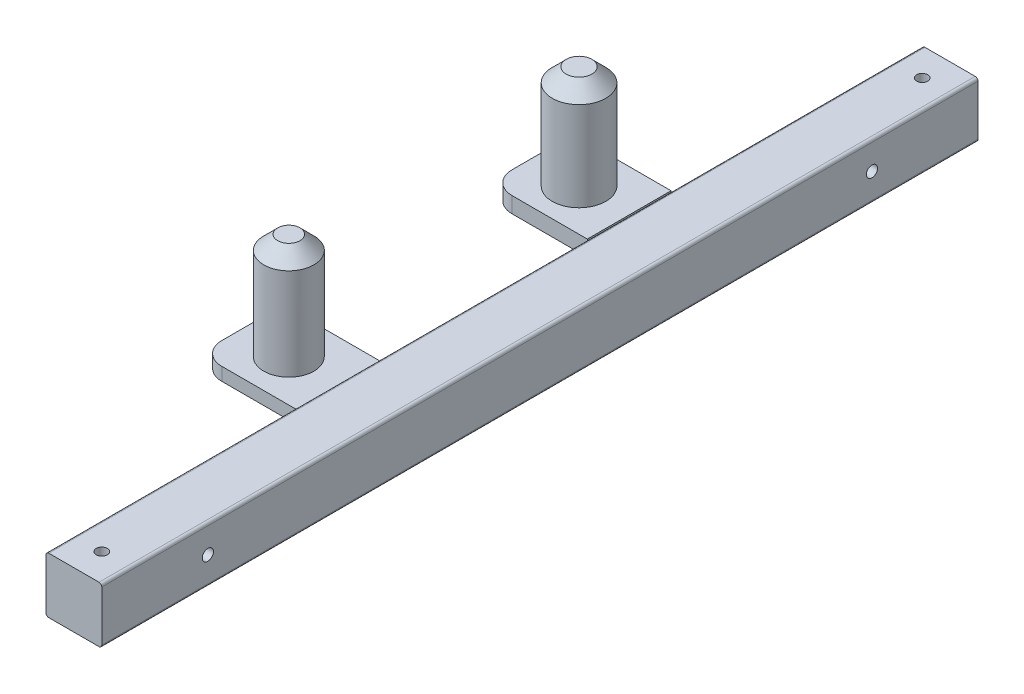
ISO-10303-21;
HEADER;
FILE_DESCRIPTION(('STEP AP214'),'2;1');
FILE_NAME('part.step','',(''),(''),'','','');
FILE_SCHEMA(('AUTOMOTIVE_DESIGN { 1 0 10303 214 1 1 1 1 }'));
ENDSEC;
DATA;
#1=APPLICATION_CONTEXT('core data for automotive mechanical design processes');
#2=APPLICATION_PROTOCOL_DEFINITION('international standard','automotive_design',2000,#1);
#3=PRODUCT_CONTEXT('',#1,'mechanical');
#4=PRODUCT('Part','Part','',(#3));
#5=PRODUCT_RELATED_PRODUCT_CATEGORY('part','',(#4));
#6=PRODUCT_DEFINITION_FORMATION('','',#4);
#7=PRODUCT_DEFINITION_CONTEXT('part definition',#1,'design');
#8=PRODUCT_DEFINITION('design','',#6,#7);
#9=PRODUCT_DEFINITION_SHAPE('','',#8);
#10=(LENGTH_UNIT() NAMED_UNIT(*) SI_UNIT(.MILLI.,.METRE.));
#11=(NAMED_UNIT(*) PLANE_ANGLE_UNIT() SI_UNIT($,.RADIAN.));
#12=(NAMED_UNIT(*) SI_UNIT($,.STERADIAN.) SOLID_ANGLE_UNIT());
#13=UNCERTAINTY_MEASURE_WITH_UNIT(LENGTH_MEASURE(1.E-05),#10,'distance_accuracy_value','');
#14=(GEOMETRIC_REPRESENTATION_CONTEXT(3) GLOBAL_UNCERTAINTY_ASSIGNED_CONTEXT((#13)) GLOBAL_UNIT_ASSIGNED_CONTEXT((#10,
#11,#12)) REPRESENTATION_CONTEXT('',''));
#15=CARTESIAN_POINT('',(0.,0.,0.));
#16=DIRECTION('',(0.,0.,1.));
#17=DIRECTION('',(1.,0.,0.));
#18=AXIS2_PLACEMENT_3D('',#15,#16,#17);
#19=CARTESIAN_POINT('',(0.,0.,314.));
#20=DIRECTION('',(1.,0.,0.));
#21=DIRECTION('',(0.,0.,-1.));
#22=AXIS2_PLACEMENT_3D('',#19,#20,#21);
#23=PLANE('',#22);
#24=CARTESIAN_POINT('',(0.,10.,276.));
#25=DIRECTION('',(-1.,0.,0.));
#26=DIRECTION('',(0.,0.,1.));
#27=AXIS2_PLACEMENT_3D('',#24,#25,#26);
#28=CIRCLE('',#27,2.);
#29=CARTESIAN_POINT('',(0.,10.,278.));
#30=VERTEX_POINT('',#29);
#31=EDGE_CURVE('E265',#30,#30,#28,.T.);
#32=ORIENTED_EDGE('',*,*,#31,.F.);
#33=EDGE_LOOP('',(#32));
#34=FACE_BOUND('',#33,.T.);
#35=CARTESIAN_POINT('',(0.,10.,38.));
#36=DIRECTION('',(-1.,0.,0.));
#37=DIRECTION('',(0.,0.,1.));
#38=AXIS2_PLACEMENT_3D('',#35,#36,#37);
#39=CIRCLE('',#38,2.);
#40=CARTESIAN_POINT('',(0.,10.,40.));
#41=VERTEX_POINT('',#40);
#42=EDGE_CURVE('E260',#41,#41,#39,.T.);
#43=ORIENTED_EDGE('',*,*,#42,.F.);
#44=EDGE_LOOP('',(#43));
#45=FACE_BOUND('',#44,.T.);
#46=DIRECTION('',(0.,1.,0.));
#47=VECTOR('',#46,1.);
#48=CARTESIAN_POINT('',(0.,19.,224.));
#49=LINE('',#48,#47);
#50=CARTESIAN_POINT('',(0.,14.3386472819823,224.));
#51=VERTEX_POINT('',#50);
#52=CARTESIAN_POINT('',(0.,19.,224.));
#53=VERTEX_POINT('',#52);
#54=EDGE_CURVE('E219',#51,#53,#49,.T.);
#55=ORIENTED_EDGE('',*,*,#54,.F.);
#56=DIRECTION('',(0.,0.,1.));
#57=VECTOR('',#56,1.);
#58=CARTESIAN_POINT('',(0.,14.3386472819823,224.));
#59=LINE('',#58,#57);
#60=CARTESIAN_POINT('',(0.,14.3386472819823,194.));
#61=VERTEX_POINT('',#60);
#62=EDGE_CURVE('E216',#61,#51,#59,.T.);
#63=ORIENTED_EDGE('',*,*,#62,.F.);
#64=DIRECTION('',(0.,-1.,0.));
#65=VECTOR('',#64,1.);
#66=CARTESIAN_POINT('',(0.,19.,194.));
#67=LINE('',#66,#65);
#68=CARTESIAN_POINT('',(0.,19.,194.));
#69=VERTEX_POINT('',#68);
#70=EDGE_CURVE('E190',#69,#61,#67,.T.);
#71=ORIENTED_EDGE('',*,*,#70,.F.);
#72=DIRECTION('',(0.,0.,-1.));
#73=VECTOR('',#72,1.);
#74=CARTESIAN_POINT('',(0.,19.,314.));
#75=LINE('',#74,#73);
#76=CARTESIAN_POINT('',(0.,19.,120.));
#77=VERTEX_POINT('',#76);
#78=EDGE_CURVE('E199',#69,#77,#75,.T.);
#79=ORIENTED_EDGE('',*,*,#78,.T.);
#80=DIRECTION('',(0.,1.,0.));
#81=VECTOR('',#80,1.);
#82=CARTESIAN_POINT('',(0.,20.,120.));
#83=LINE('',#82,#81);
#84=CARTESIAN_POINT('',(0.,14.3386472819823,120.));
#85=VERTEX_POINT('',#84);
#86=EDGE_CURVE('E248',#85,#77,#83,.T.);
#87=ORIENTED_EDGE('',*,*,#86,.F.);
#88=DIRECTION('',(0.,0.,1.));
#89=VECTOR('',#88,1.);
#90=CARTESIAN_POINT('',(0.,14.3386472819823,90.));
#91=LINE('',#90,#89);
#92=CARTESIAN_POINT('',(0.,14.3386472819823,90.));
#93=VERTEX_POINT('',#92);
#94=EDGE_CURVE('E244',#93,#85,#91,.T.);
#95=ORIENTED_EDGE('',*,*,#94,.F.);
#96=DIRECTION('',(0.,-1.,0.));
#97=VECTOR('',#96,1.);
#98=CARTESIAN_POINT('',(0.,20.,90.));
#99=LINE('',#98,#97);
#100=CARTESIAN_POINT('',(0.,19.,90.));
#101=VERTEX_POINT('',#100);
#102=EDGE_CURVE('E232',#101,#93,#99,.T.);
#103=ORIENTED_EDGE('',*,*,#102,.F.);
#104=CARTESIAN_POINT('',(0.,19.,0.));
#105=VERTEX_POINT('',#104);
#106=EDGE_CURVE('E212',#101,#105,#75,.T.);
#107=ORIENTED_EDGE('',*,*,#106,.T.);
#108=DIRECTION('',(0.,-1.,0.));
#109=VECTOR('',#108,1.);
#110=CARTESIAN_POINT('',(0.,0.,0.));
#111=LINE('',#110,#109);
#112=CARTESIAN_POINT('',(0.,1.,0.));
#113=VERTEX_POINT('',#112);
#114=EDGE_CURVE('E284',#105,#113,#111,.T.);
#115=ORIENTED_EDGE('',*,*,#114,.T.);
#116=DIRECTION('',(0.,0.,-1.));
#117=VECTOR('',#116,1.);
#118=CARTESIAN_POINT('',(0.,1.,314.));
#119=LINE('',#118,#117);
#120=CARTESIAN_POINT('',(0.,1.,314.));
#121=VERTEX_POINT('',#120);
#122=EDGE_CURVE('E321',#113,#121,#119,.F.);
#123=ORIENTED_EDGE('',*,*,#122,.T.);
#124=DIRECTION('',(0.,-1.,0.));
#125=VECTOR('',#124,1.);
#126=CARTESIAN_POINT('',(0.,0.,314.));
#127=LINE('',#126,#125);
#128=CARTESIAN_POINT('',(0.,19.,314.));
#129=VERTEX_POINT('',#128);
#130=EDGE_CURVE('E285',#129,#121,#127,.T.);
#131=ORIENTED_EDGE('',*,*,#130,.F.);
#132=EDGE_CURVE('E210',#129,#53,#75,.T.);
#133=ORIENTED_EDGE('',*,*,#132,.T.);
#134=EDGE_LOOP('',(#55,#63,#71,#79,#87,#95,#103,#107,#115,#123,#131,#133));
#135=FACE_BOUND('',#134,.T.);
#136=ADVANCED_FACE('F43',(#34,#45,#135),#23,.F.);
#137=CARTESIAN_POINT('',(0.,0.,314.));
#138=DIRECTION('',(0.,1.,0.));
#139=DIRECTION('',(0.,0.,1.));
#140=AXIS2_PLACEMENT_3D('',#137,#138,#139);
#141=PLANE('',#140);
#142=CARTESIAN_POINT('',(10.,0.,10.));
#143=DIRECTION('',(0.,1.,0.));
#144=DIRECTION('',(0.,0.,1.));
#145=AXIS2_PLACEMENT_3D('',#142,#143,#144);
#146=CIRCLE('',#145,2.);
#147=CARTESIAN_POINT('',(10.,0.,12.));
#148=VERTEX_POINT('',#147);
#149=EDGE_CURVE('E281',#148,#148,#146,.T.);
#150=ORIENTED_EDGE('',*,*,#149,.T.);
#151=EDGE_LOOP('',(#150));
#152=FACE_BOUND('',#151,.T.);
#153=CARTESIAN_POINT('',(10.,0.,304.));
#154=DIRECTION('',(0.,1.,0.));
#155=DIRECTION('',(0.,0.,1.));
#156=AXIS2_PLACEMENT_3D('',#153,#154,#155);
#157=CIRCLE('',#156,2.);
#158=CARTESIAN_POINT('',(10.,0.,306.));
#159=VERTEX_POINT('',#158);
#160=EDGE_CURVE('E276',#159,#159,#157,.T.);
#161=ORIENTED_EDGE('',*,*,#160,.T.);
#162=EDGE_LOOP('',(#161));
#163=FACE_BOUND('',#162,.T.);
#164=DIRECTION('',(1.,0.,0.));
#165=VECTOR('',#164,1.);
#166=CARTESIAN_POINT('',(0.,0.,314.));
#167=LINE('',#166,#165);
#168=CARTESIAN_POINT('',(1.,0.,314.));
#169=VERTEX_POINT('',#168);
#170=CARTESIAN_POINT('',(19.,0.,314.));
#171=VERTEX_POINT('',#170);
#172=EDGE_CURVE('E288',#169,#171,#167,.T.);
#173=ORIENTED_EDGE('',*,*,#172,.F.);
#174=DIRECTION('',(0.,0.,-1.));
#175=VECTOR('',#174,1.);
#176=CARTESIAN_POINT('',(1.,0.,314.));
#177=LINE('',#176,#175);
#178=CARTESIAN_POINT('',(1.,0.,0.));
#179=VERTEX_POINT('',#178);
#180=EDGE_CURVE('E310',#169,#179,#177,.T.);
#181=ORIENTED_EDGE('',*,*,#180,.T.);
#182=DIRECTION('',(1.,0.,0.));
#183=VECTOR('',#182,1.);
#184=CARTESIAN_POINT('',(0.,0.,0.));
#185=LINE('',#184,#183);
#186=CARTESIAN_POINT('',(19.,0.,0.));
#187=VERTEX_POINT('',#186);
#188=EDGE_CURVE('E301',#179,#187,#185,.T.);
#189=ORIENTED_EDGE('',*,*,#188,.T.);
#190=DIRECTION('',(0.,0.,-1.));
#191=VECTOR('',#190,1.);
#192=CARTESIAN_POINT('',(19.,0.,314.));
#193=LINE('',#192,#191);
#194=EDGE_CURVE('E298',#187,#171,#193,.F.);
#195=ORIENTED_EDGE('',*,*,#194,.T.);
#196=EDGE_LOOP('',(#173,#181,#189,#195));
#197=FACE_BOUND('',#196,.T.);
#198=ADVANCED_FACE('F401',(#152,#163,#197),#141,.F.);
#199=CARTESIAN_POINT('',(20.,0.,314.));
#200=DIRECTION('',(-1.,0.,0.));
#201=DIRECTION('',(0.,0.,1.));
#202=AXIS2_PLACEMENT_3D('',#199,#200,#201);
#203=PLANE('',#202);
#204=CARTESIAN_POINT('',(20.,10.,276.));
#205=DIRECTION('',(-1.,0.,0.));
#206=DIRECTION('',(0.,0.,1.));
#207=AXIS2_PLACEMENT_3D('',#204,#205,#206);
#208=CIRCLE('',#207,2.);
#209=CARTESIAN_POINT('',(20.,10.,278.));
#210=VERTEX_POINT('',#209);
#211=EDGE_CURVE('E261',#210,#210,#208,.T.);
#212=ORIENTED_EDGE('',*,*,#211,.T.);
#213=EDGE_LOOP('',(#212));
#214=FACE_BOUND('',#213,.T.);
#215=CARTESIAN_POINT('',(20.,10.,38.));
#216=DIRECTION('',(-1.,0.,0.));
#217=DIRECTION('',(0.,0.,1.));
#218=AXIS2_PLACEMENT_3D('',#215,#216,#217);
#219=CIRCLE('',#218,2.);
#220=CARTESIAN_POINT('',(20.,10.,40.));
#221=VERTEX_POINT('',#220);
#222=EDGE_CURVE('E268',#221,#221,#219,.T.);
#223=ORIENTED_EDGE('',*,*,#222,.T.);
#224=EDGE_LOOP('',(#223));
#225=FACE_BOUND('',#224,.T.);
#226=DIRECTION('',(0.,1.,0.));
#227=VECTOR('',#226,1.);
#228=CARTESIAN_POINT('',(20.,0.,314.));
#229=LINE('',#228,#227);
#230=CARTESIAN_POINT('',(20.,1.,314.));
#231=VERTEX_POINT('',#230);
#232=CARTESIAN_POINT('',(20.,19.,314.));
#233=VERTEX_POINT('',#232);
#234=EDGE_CURVE('E292',#231,#233,#229,.T.);
#235=ORIENTED_EDGE('',*,*,#234,.F.);
#236=DIRECTION('',(0.,0.,-1.));
#237=VECTOR('',#236,1.);
#238=CARTESIAN_POINT('',(20.,1.,314.));
#239=LINE('',#238,#237);
#240=CARTESIAN_POINT('',(20.,1.,0.));
#241=VERTEX_POINT('',#240);
#242=EDGE_CURVE('E333',#231,#241,#239,.T.);
#243=ORIENTED_EDGE('',*,*,#242,.T.);
#244=DIRECTION('',(0.,1.,0.));
#245=VECTOR('',#244,1.);
#246=CARTESIAN_POINT('',(20.,0.,0.));
#247=LINE('',#246,#245);
#248=CARTESIAN_POINT('',(20.,19.,0.));
#249=VERTEX_POINT('',#248);
#250=EDGE_CURVE('E304',#241,#249,#247,.T.);
#251=ORIENTED_EDGE('',*,*,#250,.T.);
#252=DIRECTION('',(0.,0.,-1.));
#253=VECTOR('',#252,1.);
#254=CARTESIAN_POINT('',(20.,19.,314.));
#255=LINE('',#254,#253);
#256=EDGE_CURVE('E331',#249,#233,#255,.F.);
#257=ORIENTED_EDGE('',*,*,#256,.T.);
#258=EDGE_LOOP('',(#235,#243,#251,#257));
#259=FACE_BOUND('',#258,.T.);
#260=ADVANCED_FACE('F409',(#214,#225,#259),#203,.F.);
#261=CARTESIAN_POINT('',(0.,20.,314.));
#262=DIRECTION('',(0.,-1.,0.));
#263=DIRECTION('',(0.,0.,-1.));
#264=AXIS2_PLACEMENT_3D('',#261,#262,#263);
#265=PLANE('',#264);
#266=CARTESIAN_POINT('',(10.,20.,10.));
#267=DIRECTION('',(0.,1.,0.));
#268=DIRECTION('',(0.,0.,1.));
#269=AXIS2_PLACEMENT_3D('',#266,#267,#268);
#270=CIRCLE('',#269,2.);
#271=CARTESIAN_POINT('',(10.,20.,12.));
#272=VERTEX_POINT('',#271);
#273=EDGE_CURVE('E273',#272,#272,#270,.T.);
#274=ORIENTED_EDGE('',*,*,#273,.F.);
#275=EDGE_LOOP('',(#274));
#276=FACE_BOUND('',#275,.T.);
#277=CARTESIAN_POINT('',(10.,20.,304.));
#278=DIRECTION('',(0.,1.,0.));
#279=DIRECTION('',(0.,0.,1.));
#280=AXIS2_PLACEMENT_3D('',#277,#278,#279);
#281=CIRCLE('',#280,2.);
#282=CARTESIAN_POINT('',(10.,20.,306.));
#283=VERTEX_POINT('',#282);
#284=EDGE_CURVE('E264',#283,#283,#281,.T.);
#285=ORIENTED_EDGE('',*,*,#284,.F.);
#286=EDGE_LOOP('',(#285));
#287=FACE_BOUND('',#286,.T.);
#288=DIRECTION('',(-1.,0.,0.));
#289=VECTOR('',#288,1.);
#290=CARTESIAN_POINT('',(0.,20.,0.));
#291=LINE('',#290,#289);
#292=CARTESIAN_POINT('',(19.,20.,0.));
#293=VERTEX_POINT('',#292);
#294=CARTESIAN_POINT('',(1.,20.,0.));
#295=VERTEX_POINT('',#294);
#296=EDGE_CURVE('E289',#293,#295,#291,.T.);
#297=ORIENTED_EDGE('',*,*,#296,.T.);
#298=DIRECTION('',(0.,0.,-1.));
#299=VECTOR('',#298,1.);
#300=CARTESIAN_POINT('',(1.,20.,314.));
#301=LINE('',#300,#299);
#302=CARTESIAN_POINT('',(1.,20.,314.));
#303=VERTEX_POINT('',#302);
#304=EDGE_CURVE('E339',#295,#303,#301,.F.);
#305=ORIENTED_EDGE('',*,*,#304,.T.);
#306=DIRECTION('',(-1.,0.,0.));
#307=VECTOR('',#306,1.);
#308=CARTESIAN_POINT('',(0.,20.,314.));
#309=LINE('',#308,#307);
#310=CARTESIAN_POINT('',(19.,20.,314.));
#311=VERTEX_POINT('',#310);
#312=EDGE_CURVE('E295',#311,#303,#309,.T.);
#313=ORIENTED_EDGE('',*,*,#312,.F.);
#314=DIRECTION('',(0.,0.,-1.));
#315=VECTOR('',#314,1.);
#316=CARTESIAN_POINT('',(19.,20.,314.));
#317=LINE('',#316,#315);
#318=EDGE_CURVE('E336',#311,#293,#317,.T.);
#319=ORIENTED_EDGE('',*,*,#318,.T.);
#320=EDGE_LOOP('',(#297,#305,#313,#319));
#321=FACE_BOUND('',#320,.T.);
#322=ADVANCED_FACE('F529',(#276,#287,#321),#265,.F.);
#323=CARTESIAN_POINT('',(0.,0.,314.));
#324=DIRECTION('',(0.,0.,-1.));
#325=DIRECTION('',(-1.,0.,0.));
#326=AXIS2_PLACEMENT_3D('',#323,#324,#325);
#327=PLANE('',#326);
#328=ORIENTED_EDGE('',*,*,#130,.T.);
#329=CARTESIAN_POINT('',(1.,1.,314.));
#330=DIRECTION('',(0.,0.,-1.));
#331=DIRECTION('',(-1.,0.,0.));
#332=AXIS2_PLACEMENT_3D('',#329,#330,#331);
#333=CIRCLE('',#332,1.);
#334=EDGE_CURVE('E329',#121,#169,#333,.F.);
#335=ORIENTED_EDGE('',*,*,#334,.T.);
#336=ORIENTED_EDGE('',*,*,#172,.T.);
#337=CARTESIAN_POINT('',(19.,1.,314.));
#338=DIRECTION('',(0.,0.,-1.));
#339=DIRECTION('',(-1.,0.,0.));
#340=AXIS2_PLACEMENT_3D('',#337,#338,#339);
#341=CIRCLE('',#340,1.);
#342=EDGE_CURVE('E327',#171,#231,#341,.F.);
#343=ORIENTED_EDGE('',*,*,#342,.T.);
#344=ORIENTED_EDGE('',*,*,#234,.T.);
#345=CARTESIAN_POINT('',(19.,19.,314.));
#346=DIRECTION('',(0.,0.,-1.));
#347=DIRECTION('',(-1.,0.,0.));
#348=AXIS2_PLACEMENT_3D('',#345,#346,#347);
#349=CIRCLE('',#348,1.);
#350=EDGE_CURVE('E323',#233,#311,#349,.F.);
#351=ORIENTED_EDGE('',*,*,#350,.T.);
#352=ORIENTED_EDGE('',*,*,#312,.T.);
#353=CARTESIAN_POINT('',(1.,19.,314.));
#354=DIRECTION('',(0.,0.,-1.));
#355=DIRECTION('',(-1.,0.,0.));
#356=AXIS2_PLACEMENT_3D('',#353,#354,#355);
#357=CIRCLE('',#356,1.);
#358=EDGE_CURVE('E325',#303,#129,#357,.F.);
#359=ORIENTED_EDGE('',*,*,#358,.T.);
#360=EDGE_LOOP('',(#328,#335,#336,#343,#344,#351,#352,#359));
#361=FACE_BOUND('',#360,.T.);
#362=ADVANCED_FACE('F526',(#361),#327,.F.);
#363=CARTESIAN_POINT('',(0.,0.,0.));
#364=DIRECTION('',(0.,0.,-1.));
#365=DIRECTION('',(-1.,0.,0.));
#366=AXIS2_PLACEMENT_3D('',#363,#364,#365);
#367=PLANE('',#366);
#368=ORIENTED_EDGE('',*,*,#188,.F.);
#369=CARTESIAN_POINT('',(1.,1.,0.));
#370=DIRECTION('',(0.,0.,-1.));
#371=DIRECTION('',(-1.,0.,0.));
#372=AXIS2_PLACEMENT_3D('',#369,#370,#371);
#373=CIRCLE('',#372,1.);
#374=EDGE_CURVE('E319',#179,#113,#373,.T.);
#375=ORIENTED_EDGE('',*,*,#374,.T.);
#376=ORIENTED_EDGE('',*,*,#114,.F.);
#377=CARTESIAN_POINT('',(1.,19.,0.));
#378=DIRECTION('',(0.,0.,-1.));
#379=DIRECTION('',(-1.,0.,0.));
#380=AXIS2_PLACEMENT_3D('',#377,#378,#379);
#381=CIRCLE('',#380,1.);
#382=EDGE_CURVE('E315',#105,#295,#381,.T.);
#383=ORIENTED_EDGE('',*,*,#382,.T.);
#384=ORIENTED_EDGE('',*,*,#296,.F.);
#385=CARTESIAN_POINT('',(19.,19.,0.));
#386=DIRECTION('',(0.,0.,-1.));
#387=DIRECTION('',(-1.,0.,0.));
#388=AXIS2_PLACEMENT_3D('',#385,#386,#387);
#389=CIRCLE('',#388,1.);
#390=EDGE_CURVE('E313',#293,#249,#389,.T.);
#391=ORIENTED_EDGE('',*,*,#390,.T.);
#392=ORIENTED_EDGE('',*,*,#250,.F.);
#393=CARTESIAN_POINT('',(19.,1.,0.));
#394=DIRECTION('',(0.,0.,-1.));
#395=DIRECTION('',(-1.,0.,0.));
#396=AXIS2_PLACEMENT_3D('',#393,#394,#395);
#397=CIRCLE('',#396,1.);
#398=EDGE_CURVE('E317',#241,#187,#397,.T.);
#399=ORIENTED_EDGE('',*,*,#398,.T.);
#400=EDGE_LOOP('',(#368,#375,#376,#383,#384,#391,#392,#399));
#401=FACE_BOUND('',#400,.T.);
#402=ADVANCED_FACE('F524',(#401),#367,.T.);
#403=CARTESIAN_POINT('',(10.,-294.,304.));
#404=DIRECTION('',(0.,1.,0.));
#405=DIRECTION('',(0.,0.,1.));
#406=AXIS2_PLACEMENT_3D('',#403,#404,#405);
#407=CYLINDRICAL_SURFACE('',#406,2.);
#408=ORIENTED_EDGE('',*,*,#284,.T.);
#409=EDGE_LOOP('',(#408));
#410=FACE_BOUND('',#409,.T.);
#411=ORIENTED_EDGE('',*,*,#160,.F.);
#412=EDGE_LOOP('',(#411));
#413=FACE_BOUND('',#412,.T.);
#414=ADVANCED_FACE('F520',(#410,#413),#407,.F.);
#415=CARTESIAN_POINT('',(10.,-294.,10.));
#416=DIRECTION('',(0.,1.,0.));
#417=DIRECTION('',(0.,0.,1.));
#418=AXIS2_PLACEMENT_3D('',#415,#416,#417);
#419=CYLINDRICAL_SURFACE('',#418,2.);
#420=ORIENTED_EDGE('',*,*,#273,.T.);
#421=EDGE_LOOP('',(#420));
#422=FACE_BOUND('',#421,.T.);
#423=ORIENTED_EDGE('',*,*,#149,.F.);
#424=EDGE_LOOP('',(#423));
#425=FACE_BOUND('',#424,.T.);
#426=ADVANCED_FACE('F420',(#422,#425),#419,.F.);
#427=CARTESIAN_POINT('',(1.,1.,314.));
#428=DIRECTION('',(0.,0.,-1.));
#429=DIRECTION('',(-1.,0.,0.));
#430=AXIS2_PLACEMENT_3D('',#427,#428,#429);
#431=CYLINDRICAL_SURFACE('',#430,1.);
#432=ORIENTED_EDGE('',*,*,#334,.F.);
#433=ORIENTED_EDGE('',*,*,#122,.F.);
#434=ORIENTED_EDGE('',*,*,#374,.F.);
#435=ORIENTED_EDGE('',*,*,#180,.F.);
#436=EDGE_LOOP('',(#432,#433,#434,#435));
#437=FACE_BOUND('',#436,.T.);
#438=ADVANCED_FACE('F416',(#437),#431,.T.);
#439=CARTESIAN_POINT('',(19.,1.,314.));
#440=DIRECTION('',(0.,0.,-1.));
#441=DIRECTION('',(-1.,0.,0.));
#442=AXIS2_PLACEMENT_3D('',#439,#440,#441);
#443=CYLINDRICAL_SURFACE('',#442,1.);
#444=ORIENTED_EDGE('',*,*,#342,.F.);
#445=ORIENTED_EDGE('',*,*,#194,.F.);
#446=ORIENTED_EDGE('',*,*,#398,.F.);
#447=ORIENTED_EDGE('',*,*,#242,.F.);
#448=EDGE_LOOP('',(#444,#445,#446,#447));
#449=FACE_BOUND('',#448,.T.);
#450=ADVANCED_FACE('F419',(#449),#443,.T.);
#451=CARTESIAN_POINT('',(1.,19.,314.));
#452=DIRECTION('',(0.,0.,-1.));
#453=DIRECTION('',(-1.,0.,0.));
#454=AXIS2_PLACEMENT_3D('',#451,#452,#453);
#455=CYLINDRICAL_SURFACE('',#454,1.);
#456=ORIENTED_EDGE('',*,*,#358,.F.);
#457=ORIENTED_EDGE('',*,*,#304,.F.);
#458=ORIENTED_EDGE('',*,*,#382,.F.);
#459=ORIENTED_EDGE('',*,*,#106,.F.);
#460=EDGE_CURVE('E206',#77,#101,#75,.T.);
#461=ORIENTED_EDGE('',*,*,#460,.F.);
#462=ORIENTED_EDGE('',*,*,#78,.F.);
#463=DIRECTION('',(0.,0.,-1.));
#464=VECTOR('',#463,1.);
#465=CARTESIAN_POINT('',(0.,19.,224.));
#466=LINE('',#465,#464);
#467=EDGE_CURVE('E203',#53,#69,#466,.T.);
#468=ORIENTED_EDGE('',*,*,#467,.F.);
#469=ORIENTED_EDGE('',*,*,#132,.F.);
#470=EDGE_LOOP('',(#456,#457,#458,#459,#461,#462,#468,#469));
#471=FACE_BOUND('',#470,.T.);
#472=ADVANCED_FACE('F201',(#471),#455,.T.);
#473=CARTESIAN_POINT('',(19.,19.,314.));
#474=DIRECTION('',(0.,0.,-1.));
#475=DIRECTION('',(-1.,0.,0.));
#476=AXIS2_PLACEMENT_3D('',#473,#474,#475);
#477=CYLINDRICAL_SURFACE('',#476,1.);
#478=ORIENTED_EDGE('',*,*,#350,.F.);
#479=ORIENTED_EDGE('',*,*,#256,.F.);
#480=ORIENTED_EDGE('',*,*,#390,.F.);
#481=ORIENTED_EDGE('',*,*,#318,.F.);
#482=EDGE_LOOP('',(#478,#479,#480,#481));
#483=FACE_BOUND('',#482,.T.);
#484=ADVANCED_FACE('F426',(#483),#477,.T.);
#485=CARTESIAN_POINT('',(20.,10.,38.));
#486=DIRECTION('',(-1.,0.,0.));
#487=DIRECTION('',(0.,0.,1.));
#488=AXIS2_PLACEMENT_3D('',#485,#486,#487);
#489=CYLINDRICAL_SURFACE('',#488,2.);
#490=ORIENTED_EDGE('',*,*,#222,.F.);
#491=EDGE_LOOP('',(#490));
#492=FACE_BOUND('',#491,.T.);
#493=ORIENTED_EDGE('',*,*,#42,.T.);
#494=EDGE_LOOP('',(#493));
#495=FACE_BOUND('',#494,.T.);
#496=ADVANCED_FACE('F429',(#492,#495),#489,.F.);
#497=CARTESIAN_POINT('',(20.,10.,276.));
#498=DIRECTION('',(-1.,0.,0.));
#499=DIRECTION('',(0.,0.,1.));
#500=AXIS2_PLACEMENT_3D('',#497,#498,#499);
#501=CYLINDRICAL_SURFACE('',#500,2.);
#502=ORIENTED_EDGE('',*,*,#211,.F.);
#503=EDGE_LOOP('',(#502));
#504=FACE_BOUND('',#503,.T.);
#505=ORIENTED_EDGE('',*,*,#31,.T.);
#506=EDGE_LOOP('',(#505));
#507=FACE_BOUND('',#506,.T.);
#508=ADVANCED_FACE('F510',(#504,#507),#501,.F.);
#509=CARTESIAN_POINT('',(-35.,20.,90.));
#510=DIRECTION('',(0.,0.,1.));
#511=DIRECTION('',(1.,0.,0.));
#512=AXIS2_PLACEMENT_3D('',#509,#510,#511);
#513=PLANE('',#512);
#514=DIRECTION('',(1.,0.,0.));
#515=VECTOR('',#514,1.);
#516=CARTESIAN_POINT('',(-35.,14.3386472819823,90.));
#517=LINE('',#516,#515);
#518=CARTESIAN_POINT('',(-27.,14.3386472819823,90.));
#519=VERTEX_POINT('',#518);
#520=EDGE_CURVE('E258',#519,#93,#517,.T.);
#521=ORIENTED_EDGE('',*,*,#520,.F.);
#522=DIRECTION('',(0.,-1.,0.));
#523=VECTOR('',#522,1.);
#524=CARTESIAN_POINT('',(-27.,20.,90.));
#525=LINE('',#524,#523);
#526=CARTESIAN_POINT('',(-27.,20.,90.));
#527=VERTEX_POINT('',#526);
#528=EDGE_CURVE('E357',#519,#527,#525,.F.);
#529=ORIENTED_EDGE('',*,*,#528,.T.);
#530=DIRECTION('',(1.,0.,0.));
#531=VECTOR('',#530,1.);
#532=CARTESIAN_POINT('',(-35.,20.,90.));
#533=LINE('',#532,#531);
#534=CARTESIAN_POINT('',(0.,20.,90.));
#535=VERTEX_POINT('',#534);
#536=EDGE_CURVE('E240',#527,#535,#533,.T.);
#537=ORIENTED_EDGE('',*,*,#536,.T.);
#538=EDGE_CURVE('E241',#535,#101,#99,.T.);
#539=ORIENTED_EDGE('',*,*,#538,.T.);
#540=ORIENTED_EDGE('',*,*,#102,.T.);
#541=EDGE_LOOP('',(#521,#529,#537,#539,#540));
#542=FACE_BOUND('',#541,.T.);
#543=ADVANCED_FACE('F506',(#542),#513,.F.);
#544=CARTESIAN_POINT('',(-35.,14.3386472819823,90.));
#545=DIRECTION('',(0.,1.,0.));
#546=DIRECTION('',(0.,0.,1.));
#547=AXIS2_PLACEMENT_3D('',#544,#545,#546);
#548=PLANE('',#547);
#549=DIRECTION('',(0.,0.,1.));
#550=VECTOR('',#549,1.);
#551=CARTESIAN_POINT('',(-35.,14.3386472819823,90.));
#552=LINE('',#551,#550);
#553=CARTESIAN_POINT('',(-35.,14.3386472819823,98.));
#554=VERTEX_POINT('',#553);
#555=CARTESIAN_POINT('',(-35.,14.3386472819823,112.));
#556=VERTEX_POINT('',#555);
#557=EDGE_CURVE('E233',#554,#556,#552,.T.);
#558=ORIENTED_EDGE('',*,*,#557,.F.);
#559=CARTESIAN_POINT('',(-27.,14.3386472819823,98.));
#560=DIRECTION('',(0.,1.,0.));
#561=DIRECTION('',(0.,0.,1.));
#562=AXIS2_PLACEMENT_3D('',#559,#560,#561);
#563=CIRCLE('',#562,8.);
#564=EDGE_CURVE('E355',#554,#519,#563,.F.);
#565=ORIENTED_EDGE('',*,*,#564,.T.);
#566=ORIENTED_EDGE('',*,*,#520,.T.);
#567=ORIENTED_EDGE('',*,*,#94,.T.);
#568=DIRECTION('',(1.,0.,0.));
#569=VECTOR('',#568,1.);
#570=CARTESIAN_POINT('',(-35.,14.3386472819823,120.));
#571=LINE('',#570,#569);
#572=CARTESIAN_POINT('',(-27.,14.3386472819823,120.));
#573=VERTEX_POINT('',#572);
#574=EDGE_CURVE('E256',#573,#85,#571,.T.);
#575=ORIENTED_EDGE('',*,*,#574,.F.);
#576=CARTESIAN_POINT('',(-27.,14.3386472819823,112.));
#577=DIRECTION('',(0.,1.,0.));
#578=DIRECTION('',(0.,0.,1.));
#579=AXIS2_PLACEMENT_3D('',#576,#577,#578);
#580=CIRCLE('',#579,8.);
#581=EDGE_CURVE('E353',#573,#556,#580,.F.);
#582=ORIENTED_EDGE('',*,*,#581,.T.);
#583=EDGE_LOOP('',(#558,#565,#566,#567,#575,#582));
#584=FACE_BOUND('',#583,.T.);
#585=ADVANCED_FACE('F502',(#584),#548,.F.);
#586=CARTESIAN_POINT('',(-35.,20.,120.));
#587=DIRECTION('',(0.,0.,-1.));
#588=DIRECTION('',(-1.,0.,0.));
#589=AXIS2_PLACEMENT_3D('',#586,#587,#588);
#590=PLANE('',#589);
#591=DIRECTION('',(1.,0.,0.));
#592=VECTOR('',#591,1.);
#593=CARTESIAN_POINT('',(-35.,20.,120.));
#594=LINE('',#593,#592);
#595=CARTESIAN_POINT('',(-27.,20.,120.));
#596=VERTEX_POINT('',#595);
#597=CARTESIAN_POINT('',(0.,20.,120.));
#598=VERTEX_POINT('',#597);
#599=EDGE_CURVE('E254',#596,#598,#594,.T.);
#600=ORIENTED_EDGE('',*,*,#599,.F.);
#601=DIRECTION('',(0.,1.,0.));
#602=VECTOR('',#601,1.);
#603=CARTESIAN_POINT('',(-27.,14.3386472819823,120.));
#604=LINE('',#603,#602);
#605=EDGE_CURVE('E363',#596,#573,#604,.F.);
#606=ORIENTED_EDGE('',*,*,#605,.T.);
#607=ORIENTED_EDGE('',*,*,#574,.T.);
#608=ORIENTED_EDGE('',*,*,#86,.T.);
#609=EDGE_CURVE('E247',#77,#598,#83,.T.);
#610=ORIENTED_EDGE('',*,*,#609,.T.);
#611=EDGE_LOOP('',(#600,#606,#607,#608,#610));
#612=FACE_BOUND('',#611,.T.);
#613=ADVANCED_FACE('F498',(#612),#590,.F.);
#614=CARTESIAN_POINT('',(-35.,20.,90.));
#615=DIRECTION('',(0.,-1.,0.));
#616=DIRECTION('',(0.,0.,-1.));
#617=AXIS2_PLACEMENT_3D('',#614,#615,#616);
#618=PLANE('',#617);
#619=CARTESIAN_POINT('',(-17.9782922090873,20.,105.));
#620=DIRECTION('',(0.,-1.,0.));
#621=DIRECTION('',(0.,0.,-1.));
#622=AXIS2_PLACEMENT_3D('',#619,#620,#621);
#623=CIRCLE('',#622,9.5979035147247);
#624=CARTESIAN_POINT('',(-17.9782922090873,20.,95.4020964852753));
#625=VERTEX_POINT('',#624);
#626=EDGE_CURVE('E344',#625,#625,#623,.F.);
#627=ORIENTED_EDGE('',*,*,#626,.F.);
#628=EDGE_LOOP('',(#627));
#629=FACE_BOUND('',#628,.T.);
#630=ORIENTED_EDGE('',*,*,#536,.F.);
#631=CARTESIAN_POINT('',(-27.,20.,98.));
#632=DIRECTION('',(0.,-1.,0.));
#633=DIRECTION('',(0.,0.,-1.));
#634=AXIS2_PLACEMENT_3D('',#631,#632,#633);
#635=CIRCLE('',#634,8.);
#636=CARTESIAN_POINT('',(-35.,20.,98.));
#637=VERTEX_POINT('',#636);
#638=EDGE_CURVE('E361',#527,#637,#635,.F.);
#639=ORIENTED_EDGE('',*,*,#638,.T.);
#640=DIRECTION('',(0.,0.,-1.));
#641=VECTOR('',#640,1.);
#642=CARTESIAN_POINT('',(-35.,20.,90.));
#643=LINE('',#642,#641);
#644=CARTESIAN_POINT('',(-35.,20.,112.));
#645=VERTEX_POINT('',#644);
#646=EDGE_CURVE('E236',#645,#637,#643,.T.);
#647=ORIENTED_EDGE('',*,*,#646,.F.);
#648=CARTESIAN_POINT('',(-27.,20.,112.));
#649=DIRECTION('',(0.,-1.,0.));
#650=DIRECTION('',(0.,0.,-1.));
#651=AXIS2_PLACEMENT_3D('',#648,#649,#650);
#652=CIRCLE('',#651,8.);
#653=EDGE_CURVE('E359',#645,#596,#652,.F.);
#654=ORIENTED_EDGE('',*,*,#653,.T.);
#655=ORIENTED_EDGE('',*,*,#599,.T.);
#656=DIRECTION('',(0.,0.,-1.));
#657=VECTOR('',#656,1.);
#658=CARTESIAN_POINT('',(0.,20.,90.));
#659=LINE('',#658,#657);
#660=EDGE_CURVE('E237',#598,#535,#659,.T.);
#661=ORIENTED_EDGE('',*,*,#660,.T.);
#662=EDGE_LOOP('',(#630,#639,#647,#654,#655,#661));
#663=FACE_BOUND('',#662,.T.);
#664=ADVANCED_FACE('F491',(#629,#663),#618,.F.);
#665=CARTESIAN_POINT('',(-35.,0.,0.));
#666=DIRECTION('',(-1.,0.,0.));
#667=DIRECTION('',(0.,0.,1.));
#668=AXIS2_PLACEMENT_3D('',#665,#666,#667);
#669=PLANE('',#668);
#670=ORIENTED_EDGE('',*,*,#646,.T.);
#671=DIRECTION('',(0.,-1.,0.));
#672=VECTOR('',#671,1.);
#673=CARTESIAN_POINT('',(-35.,14.3386472819823,98.));
#674=LINE('',#673,#672);
#675=EDGE_CURVE('E350',#637,#554,#674,.T.);
#676=ORIENTED_EDGE('',*,*,#675,.T.);
#677=ORIENTED_EDGE('',*,*,#557,.T.);
#678=DIRECTION('',(0.,1.,0.));
#679=VECTOR('',#678,1.);
#680=CARTESIAN_POINT('',(-35.,20.,112.));
#681=LINE('',#680,#679);
#682=EDGE_CURVE('E347',#556,#645,#681,.T.);
#683=ORIENTED_EDGE('',*,*,#682,.T.);
#684=EDGE_LOOP('',(#670,#676,#677,#683));
#685=FACE_BOUND('',#684,.T.);
#686=ADVANCED_FACE('F488',(#685),#669,.T.);
#687=CARTESIAN_POINT('',(0.,0.,0.));
#688=DIRECTION('',(-1.,0.,0.));
#689=DIRECTION('',(0.,0.,1.));
#690=AXIS2_PLACEMENT_3D('',#687,#688,#689);
#691=PLANE('',#690);
#692=ORIENTED_EDGE('',*,*,#460,.T.);
#693=ORIENTED_EDGE('',*,*,#538,.F.);
#694=ORIENTED_EDGE('',*,*,#660,.F.);
#695=ORIENTED_EDGE('',*,*,#609,.F.);
#696=EDGE_LOOP('',(#692,#693,#694,#695));
#697=FACE_BOUND('',#696,.T.);
#698=ADVANCED_FACE('F486',(#697),#691,.F.);
#699=CARTESIAN_POINT('',(-35.,19.,224.));
#700=DIRECTION('',(0.,0.,-1.));
#701=DIRECTION('',(-1.,0.,0.));
#702=AXIS2_PLACEMENT_3D('',#699,#700,#701);
#703=PLANE('',#702);
#704=DIRECTION('',(1.,0.,0.));
#705=VECTOR('',#704,1.);
#706=CARTESIAN_POINT('',(-35.,19.,224.));
#707=LINE('',#706,#705);
#708=CARTESIAN_POINT('',(-27.,19.,224.));
#709=VERTEX_POINT('',#708);
#710=EDGE_CURVE('E193',#709,#53,#707,.T.);
#711=ORIENTED_EDGE('',*,*,#710,.F.);
#712=DIRECTION('',(0.,1.,0.));
#713=VECTOR('',#712,1.);
#714=CARTESIAN_POINT('',(-27.,19.,224.));
#715=LINE('',#714,#713);
#716=CARTESIAN_POINT('',(-27.,14.3386472819823,224.));
#717=VERTEX_POINT('',#716);
#718=EDGE_CURVE('E379',#709,#717,#715,.F.);
#719=ORIENTED_EDGE('',*,*,#718,.T.);
#720=DIRECTION('',(1.,0.,0.));
#721=VECTOR('',#720,1.);
#722=CARTESIAN_POINT('',(-35.,14.3386472819823,224.));
#723=LINE('',#722,#721);
#724=EDGE_CURVE('E227',#717,#51,#723,.T.);
#725=ORIENTED_EDGE('',*,*,#724,.T.);
#726=ORIENTED_EDGE('',*,*,#54,.T.);
#727=EDGE_LOOP('',(#711,#719,#725,#726));
#728=FACE_BOUND('',#727,.T.);
#729=ADVANCED_FACE('F482',(#728),#703,.F.);
#730=CARTESIAN_POINT('',(-35.,19.,224.));
#731=DIRECTION('',(0.,-1.,0.));
#732=DIRECTION('',(0.,0.,-1.));
#733=AXIS2_PLACEMENT_3D('',#730,#731,#732);
#734=PLANE('',#733);
#735=CARTESIAN_POINT('',(-17.9782922090873,19.,209.));
#736=DIRECTION('',(0.,-1.,0.));
#737=DIRECTION('',(0.,0.,-1.));
#738=AXIS2_PLACEMENT_3D('',#735,#736,#737);
#739=CIRCLE('',#738,8.99319582323081);
#740=CARTESIAN_POINT('',(-17.9782922090873,19.,200.006804176769));
#741=VERTEX_POINT('',#740);
#742=EDGE_CURVE('E341',#741,#741,#739,.F.);
#743=ORIENTED_EDGE('',*,*,#742,.F.);
#744=EDGE_LOOP('',(#743));
#745=FACE_BOUND('',#744,.T.);
#746=DIRECTION('',(1.,0.,0.));
#747=VECTOR('',#746,1.);
#748=CARTESIAN_POINT('',(-35.,19.,194.));
#749=LINE('',#748,#747);
#750=CARTESIAN_POINT('',(-27.,19.,194.));
#751=VERTEX_POINT('',#750);
#752=EDGE_CURVE('E186',#751,#69,#749,.T.);
#753=ORIENTED_EDGE('',*,*,#752,.F.);
#754=CARTESIAN_POINT('',(-27.,19.,202.));
#755=DIRECTION('',(0.,-1.,0.));
#756=DIRECTION('',(0.,0.,-1.));
#757=AXIS2_PLACEMENT_3D('',#754,#755,#756);
#758=CIRCLE('',#757,8.);
#759=CARTESIAN_POINT('',(-35.,19.,202.));
#760=VERTEX_POINT('',#759);
#761=EDGE_CURVE('E377',#751,#760,#758,.F.);
#762=ORIENTED_EDGE('',*,*,#761,.T.);
#763=DIRECTION('',(0.,0.,-1.));
#764=VECTOR('',#763,1.);
#765=CARTESIAN_POINT('',(-35.,19.,224.));
#766=LINE('',#765,#764);
#767=CARTESIAN_POINT('',(-35.,19.,216.));
#768=VERTEX_POINT('',#767);
#769=EDGE_CURVE('E226',#768,#760,#766,.T.);
#770=ORIENTED_EDGE('',*,*,#769,.F.);
#771=CARTESIAN_POINT('',(-27.,19.,216.));
#772=DIRECTION('',(0.,-1.,0.));
#773=DIRECTION('',(0.,0.,-1.));
#774=AXIS2_PLACEMENT_3D('',#771,#772,#773);
#775=CIRCLE('',#774,8.);
#776=EDGE_CURVE('E59',#768,#709,#775,.F.);
#777=ORIENTED_EDGE('',*,*,#776,.T.);
#778=ORIENTED_EDGE('',*,*,#710,.T.);
#779=ORIENTED_EDGE('',*,*,#467,.T.);
#780=EDGE_LOOP('',(#753,#762,#770,#777,#778,#779));
#781=FACE_BOUND('',#780,.T.);
#782=ADVANCED_FACE('F218',(#745,#781),#734,.F.);
#783=CARTESIAN_POINT('',(-35.,19.,194.));
#784=DIRECTION('',(0.,0.,1.));
#785=DIRECTION('',(1.,0.,0.));
#786=AXIS2_PLACEMENT_3D('',#783,#784,#785);
#787=PLANE('',#786);
#788=DIRECTION('',(1.,0.,0.));
#789=VECTOR('',#788,1.);
#790=CARTESIAN_POINT('',(-35.,14.3386472819823,194.));
#791=LINE('',#790,#789);
#792=CARTESIAN_POINT('',(-27.,14.3386472819823,194.));
#793=VERTEX_POINT('',#792);
#794=EDGE_CURVE('E194',#793,#61,#791,.T.);
#795=ORIENTED_EDGE('',*,*,#794,.F.);
#796=DIRECTION('',(0.,-1.,0.));
#797=VECTOR('',#796,1.);
#798=CARTESIAN_POINT('',(-27.,19.,194.));
#799=LINE('',#798,#797);
#800=EDGE_CURVE('E67',#793,#751,#799,.F.);
#801=ORIENTED_EDGE('',*,*,#800,.T.);
#802=ORIENTED_EDGE('',*,*,#752,.T.);
#803=ORIENTED_EDGE('',*,*,#70,.T.);
#804=EDGE_LOOP('',(#795,#801,#802,#803));
#805=FACE_BOUND('',#804,.T.);
#806=ADVANCED_FACE('F188',(#805),#787,.F.);
#807=CARTESIAN_POINT('',(-35.,14.3386472819823,224.));
#808=DIRECTION('',(0.,1.,0.));
#809=DIRECTION('',(0.,0.,1.));
#810=AXIS2_PLACEMENT_3D('',#807,#808,#809);
#811=PLANE('',#810);
#812=DIRECTION('',(0.,0.,1.));
#813=VECTOR('',#812,1.);
#814=CARTESIAN_POINT('',(-35.,14.3386472819823,224.));
#815=LINE('',#814,#813);
#816=CARTESIAN_POINT('',(-35.,14.3386472819823,202.));
#817=VERTEX_POINT('',#816);
#818=CARTESIAN_POINT('',(-35.,14.3386472819823,216.));
#819=VERTEX_POINT('',#818);
#820=EDGE_CURVE('E229',#817,#819,#815,.T.);
#821=ORIENTED_EDGE('',*,*,#820,.F.);
#822=CARTESIAN_POINT('',(-27.,14.3386472819823,202.));
#823=DIRECTION('',(0.,1.,0.));
#824=DIRECTION('',(0.,0.,1.));
#825=AXIS2_PLACEMENT_3D('',#822,#823,#824);
#826=CIRCLE('',#825,8.);
#827=EDGE_CURVE('E373',#817,#793,#826,.F.);
#828=ORIENTED_EDGE('',*,*,#827,.T.);
#829=ORIENTED_EDGE('',*,*,#794,.T.);
#830=ORIENTED_EDGE('',*,*,#62,.T.);
#831=ORIENTED_EDGE('',*,*,#724,.F.);
#832=CARTESIAN_POINT('',(-27.,14.3386472819823,216.));
#833=DIRECTION('',(0.,1.,0.));
#834=DIRECTION('',(0.,0.,1.));
#835=AXIS2_PLACEMENT_3D('',#832,#833,#834);
#836=CIRCLE('',#835,8.);
#837=EDGE_CURVE('E371',#717,#819,#836,.F.);
#838=ORIENTED_EDGE('',*,*,#837,.T.);
#839=EDGE_LOOP('',(#821,#828,#829,#830,#831,#838));
#840=FACE_BOUND('',#839,.T.);
#841=ADVANCED_FACE('F460',(#840),#811,.F.);
#842=CARTESIAN_POINT('',(-35.,0.,0.));
#843=DIRECTION('',(1.,0.,0.));
#844=DIRECTION('',(0.,0.,-1.));
#845=AXIS2_PLACEMENT_3D('',#842,#843,#844);
#846=PLANE('',#845);
#847=ORIENTED_EDGE('',*,*,#769,.T.);
#848=DIRECTION('',(0.,-1.,0.));
#849=VECTOR('',#848,1.);
#850=CARTESIAN_POINT('',(-35.,0.,202.));
#851=LINE('',#850,#849);
#852=EDGE_CURVE('E368',#760,#817,#851,.T.);
#853=ORIENTED_EDGE('',*,*,#852,.T.);
#854=ORIENTED_EDGE('',*,*,#820,.T.);
#855=DIRECTION('',(0.,1.,0.));
#856=VECTOR('',#855,1.);
#857=CARTESIAN_POINT('',(-35.,0.,216.));
#858=LINE('',#857,#856);
#859=EDGE_CURVE('E365',#819,#768,#858,.T.);
#860=ORIENTED_EDGE('',*,*,#859,.T.);
#861=EDGE_LOOP('',(#847,#853,#854,#860));
#862=FACE_BOUND('',#861,.T.);
#863=ADVANCED_FACE('F463',(#862),#846,.F.);
#864=CARTESIAN_POINT('',(-17.9782922090873,57.,209.));
#865=DIRECTION('',(0.,-1.,0.));
#866=DIRECTION('',(0.,0.,-1.));
#867=AXIS2_PLACEMENT_3D('',#864,#865,#866);
#868=CYLINDRICAL_SURFACE('',#867,8.99319582323081);
#869=CARTESIAN_POINT('',(-17.9782922090873,52.,209.));
#870=DIRECTION('',(0.,1.,0.));
#871=DIRECTION('',(0.,0.,1.));
#872=AXIS2_PLACEMENT_3D('',#869,#870,#871);
#873=CIRCLE('',#872,8.99319582323081);
#874=CARTESIAN_POINT('',(-17.9782922090873,52.,217.993195823231));
#875=VERTEX_POINT('',#874);
#876=EDGE_CURVE('E11',#875,#875,#873,.F.);
#877=ORIENTED_EDGE('',*,*,#876,.T.);
#878=EDGE_LOOP('',(#877));
#879=FACE_BOUND('',#878,.T.);
#880=ORIENTED_EDGE('',*,*,#742,.T.);
#881=EDGE_LOOP('',(#880));
#882=FACE_BOUND('',#881,.T.);
#883=ADVANCED_FACE('F467',(#879,#882),#868,.T.);
#884=CARTESIAN_POINT('',(-17.9782922090873,57.,209.));
#885=DIRECTION('',(0.,1.,0.));
#886=DIRECTION('',(0.,0.,1.));
#887=AXIS2_PLACEMENT_3D('',#884,#885,#886);
#888=PLANE('',#887);
#889=CARTESIAN_POINT('',(-17.9782922090873,57.,209.));
#890=DIRECTION('',(0.,1.,0.));
#891=DIRECTION('',(0.,0.,1.));
#892=AXIS2_PLACEMENT_3D('',#889,#890,#891);
#893=CIRCLE('',#892,3.9931958232309);
#894=CARTESIAN_POINT('',(-17.9782922090873,57.,212.993195823231));
#895=VERTEX_POINT('',#894);
#896=EDGE_CURVE('E52',#895,#895,#893,.T.);
#897=ORIENTED_EDGE('',*,*,#896,.T.);
#898=EDGE_LOOP('',(#897));
#899=FACE_BOUND('',#898,.T.);
#900=ADVANCED_FACE('F389',(#899),#888,.T.);
#901=CARTESIAN_POINT('',(-17.9782922090873,57.,105.));
#902=DIRECTION('',(0.,-1.,0.));
#903=DIRECTION('',(0.,0.,-1.));
#904=AXIS2_PLACEMENT_3D('',#901,#902,#903);
#905=CYLINDRICAL_SURFACE('',#904,9.5979035147247);
#906=CARTESIAN_POINT('',(-17.9782922090873,51.9999999999999,105.));
#907=DIRECTION('',(0.,1.,0.));
#908=DIRECTION('',(0.,0.,1.));
#909=AXIS2_PLACEMENT_3D('',#906,#907,#908);
#910=CIRCLE('',#909,9.5979035147247);
#911=CARTESIAN_POINT('',(-17.9782922090873,51.9999999999999,95.4020964852753));
#912=VERTEX_POINT('',#911);
#913=EDGE_CURVE('E384',#912,#912,#910,.F.);
#914=ORIENTED_EDGE('',*,*,#913,.T.);
#915=EDGE_LOOP('',(#914));
#916=FACE_BOUND('',#915,.T.);
#917=ORIENTED_EDGE('',*,*,#626,.T.);
#918=EDGE_LOOP('',(#917));
#919=FACE_BOUND('',#918,.T.);
#920=ADVANCED_FACE('F691',(#916,#919),#905,.T.);
#921=CARTESIAN_POINT('',(-17.9782922090873,57.,105.));
#922=DIRECTION('',(0.,1.,0.));
#923=DIRECTION('',(0.,0.,1.));
#924=AXIS2_PLACEMENT_3D('',#921,#922,#923);
#925=PLANE('',#924);
#926=CARTESIAN_POINT('',(-17.9782922090873,57.,105.));
#927=DIRECTION('',(0.,1.,0.));
#928=DIRECTION('',(0.,0.,1.));
#929=AXIS2_PLACEMENT_3D('',#926,#927,#928);
#930=CIRCLE('',#929,4.59790351472467);
#931=CARTESIAN_POINT('',(-17.9782922090873,57.,100.402096485275));
#932=VERTEX_POINT('',#931);
#933=EDGE_CURVE('E381',#932,#932,#930,.T.);
#934=ORIENTED_EDGE('',*,*,#933,.T.);
#935=EDGE_LOOP('',(#934));
#936=FACE_BOUND('',#935,.T.);
#937=ADVANCED_FACE('F435',(#936),#925,.T.);
#938=CARTESIAN_POINT('',(-27.,0.,98.));
#939=DIRECTION('',(0.,1.,0.));
#940=DIRECTION('',(0.,0.,1.));
#941=AXIS2_PLACEMENT_3D('',#938,#939,#940);
#942=CYLINDRICAL_SURFACE('',#941,8.);
#943=ORIENTED_EDGE('',*,*,#638,.F.);
#944=ORIENTED_EDGE('',*,*,#528,.F.);
#945=ORIENTED_EDGE('',*,*,#564,.F.);
#946=ORIENTED_EDGE('',*,*,#675,.F.);
#947=EDGE_LOOP('',(#943,#944,#945,#946));
#948=FACE_BOUND('',#947,.T.);
#949=ADVANCED_FACE('F431',(#948),#942,.T.);
#950=CARTESIAN_POINT('',(-27.,0.,112.));
#951=DIRECTION('',(0.,-1.,0.));
#952=DIRECTION('',(0.,0.,-1.));
#953=AXIS2_PLACEMENT_3D('',#950,#951,#952);
#954=CYLINDRICAL_SURFACE('',#953,8.);
#955=ORIENTED_EDGE('',*,*,#581,.F.);
#956=ORIENTED_EDGE('',*,*,#605,.F.);
#957=ORIENTED_EDGE('',*,*,#653,.F.);
#958=ORIENTED_EDGE('',*,*,#682,.F.);
#959=EDGE_LOOP('',(#955,#956,#957,#958));
#960=FACE_BOUND('',#959,.T.);
#961=ADVANCED_FACE('F434',(#960),#954,.T.);
#962=CARTESIAN_POINT('',(-27.,0.,202.));
#963=DIRECTION('',(0.,-1.,0.));
#964=DIRECTION('',(0.,0.,-1.));
#965=AXIS2_PLACEMENT_3D('',#962,#963,#964);
#966=CYLINDRICAL_SURFACE('',#965,8.);
#967=ORIENTED_EDGE('',*,*,#761,.F.);
#968=ORIENTED_EDGE('',*,*,#800,.F.);
#969=ORIENTED_EDGE('',*,*,#827,.F.);
#970=ORIENTED_EDGE('',*,*,#852,.F.);
#971=EDGE_LOOP('',(#967,#968,#969,#970));
#972=FACE_BOUND('',#971,.T.);
#973=ADVANCED_FACE('F439',(#972),#966,.T.);
#974=CARTESIAN_POINT('',(-27.,0.,216.));
#975=DIRECTION('',(0.,1.,0.));
#976=DIRECTION('',(0.,0.,1.));
#977=AXIS2_PLACEMENT_3D('',#974,#975,#976);
#978=CYLINDRICAL_SURFACE('',#977,8.);
#979=ORIENTED_EDGE('',*,*,#837,.F.);
#980=ORIENTED_EDGE('',*,*,#718,.F.);
#981=ORIENTED_EDGE('',*,*,#776,.F.);
#982=ORIENTED_EDGE('',*,*,#859,.F.);
#983=EDGE_LOOP('',(#979,#980,#981,#982));
#984=FACE_BOUND('',#983,.T.);
#985=ADVANCED_FACE('F397',(#984),#978,.T.);
#986=CARTESIAN_POINT('',(-17.9782922090873,57.,105.));
#987=DIRECTION('',(0.,-1.,0.));
#988=DIRECTION('',(0.,0.,-1.));
#989=AXIS2_PLACEMENT_3D('',#986,#987,#988);
#990=CONICAL_SURFACE('',#989,4.59790351472467,0.785398163397446);
#991=CARTESIAN_POINT('',(-17.9782922090873,51.9999999999999,95.4020964852753));
#992=CARTESIAN_POINT('',(-17.9782922090873,52.0520833333333,95.4541798186086));
#993=CARTESIAN_POINT('',(-17.9782922090873,52.1041666666666,95.506263151942));
#994=CARTESIAN_POINT('',(-17.9782922090873,52.2083333333333,95.6104298186086));
#995=CARTESIAN_POINT('',(-17.9782922090873,52.2604166666666,95.662513151942));
#996=CARTESIAN_POINT('',(-17.9782922090873,52.3645833333333,95.7666798186086));
#997=CARTESIAN_POINT('',(-17.9782922090873,52.4166666666666,95.818763151942));
#998=CARTESIAN_POINT('',(-17.9782922090873,52.5208333333333,95.9229298186086));
#999=CARTESIAN_POINT('',(-17.9782922090873,52.5729166666666,95.975013151942));
#1000=CARTESIAN_POINT('',(-17.9782922090873,52.6770833333333,96.0791798186086));
#1001=CARTESIAN_POINT('',(-17.9782922090873,52.7291666666666,96.131263151942));
#1002=CARTESIAN_POINT('',(-17.9782922090873,52.8333333333333,96.2354298186086));
#1003=CARTESIAN_POINT('',(-17.9782922090873,52.8854166666666,96.287513151942));
#1004=CARTESIAN_POINT('',(-17.9782922090873,52.9895833333333,96.3916798186086));
#1005=CARTESIAN_POINT('',(-17.9782922090873,53.0416666666666,96.443763151942));
#1006=CARTESIAN_POINT('',(-17.9782922090873,53.1458333333333,96.5479298186086));
#1007=CARTESIAN_POINT('',(-17.9782922090873,53.1979166666666,96.600013151942));
#1008=CARTESIAN_POINT('',(-17.9782922090873,53.3020833333333,96.7041798186086));
#1009=CARTESIAN_POINT('',(-17.9782922090873,53.3541666666666,96.756263151942));
#1010=CARTESIAN_POINT('',(-17.9782922090873,53.4583333333333,96.8604298186086));
#1011=CARTESIAN_POINT('',(-17.9782922090873,53.5104166666666,96.912513151942));
#1012=CARTESIAN_POINT('',(-17.9782922090873,53.6145833333333,97.0166798186086));
#1013=CARTESIAN_POINT('',(-17.9782922090873,53.6666666666666,97.068763151942));
#1014=CARTESIAN_POINT('',(-17.9782922090873,53.7708333333333,97.1729298186086));
#1015=CARTESIAN_POINT('',(-17.9782922090873,53.8229166666666,97.225013151942));
#1016=CARTESIAN_POINT('',(-17.9782922090873,53.9270833333333,97.3291798186086));
#1017=CARTESIAN_POINT('',(-17.9782922090873,53.9791666666666,97.381263151942));
#1018=CARTESIAN_POINT('',(-17.9782922090873,54.0833333333333,97.4854298186086));
#1019=CARTESIAN_POINT('',(-17.9782922090873,54.1354166666666,97.537513151942));
#1020=CARTESIAN_POINT('',(-17.9782922090873,54.2395833333333,97.6416798186086));
#1021=CARTESIAN_POINT('',(-17.9782922090873,54.2916666666666,97.693763151942));
#1022=CARTESIAN_POINT('',(-17.9782922090873,54.3958333333333,97.7979298186087));
#1023=CARTESIAN_POINT('',(-17.9782922090873,54.4479166666666,97.850013151942));
#1024=CARTESIAN_POINT('',(-17.9782922090873,54.5520833333333,97.9541798186086));
#1025=CARTESIAN_POINT('',(-17.9782922090873,54.6041666666666,98.006263151942));
#1026=CARTESIAN_POINT('',(-17.9782922090873,54.7083333333333,98.1104298186086));
#1027=CARTESIAN_POINT('',(-17.9782922090873,54.7604166666666,98.162513151942));
#1028=CARTESIAN_POINT('',(-17.9782922090873,54.8645833333333,98.2666798186087));
#1029=CARTESIAN_POINT('',(-17.9782922090873,54.9166666666666,98.318763151942));
#1030=CARTESIAN_POINT('',(-17.9782922090873,55.0208333333333,98.4229298186087));
#1031=CARTESIAN_POINT('',(-17.9782922090873,55.0729166666666,98.475013151942));
#1032=CARTESIAN_POINT('',(-17.9782922090873,55.1770833333333,98.5791798186086));
#1033=CARTESIAN_POINT('',(-17.9782922090873,55.2291666666666,98.631263151942));
#1034=CARTESIAN_POINT('',(-17.9782922090873,55.3333333333333,98.7354298186087));
#1035=CARTESIAN_POINT('',(-17.9782922090873,55.3854166666666,98.787513151942));
#1036=CARTESIAN_POINT('',(-17.9782922090873,55.4895833333333,98.8916798186087));
#1037=CARTESIAN_POINT('',(-17.9782922090873,55.5416666666666,98.943763151942));
#1038=CARTESIAN_POINT('',(-17.9782922090873,55.6458333333333,99.0479298186087));
#1039=CARTESIAN_POINT('',(-17.9782922090873,55.6979166666666,99.100013151942));
#1040=CARTESIAN_POINT('',(-17.9782922090873,55.8020833333333,99.2041798186087));
#1041=CARTESIAN_POINT('',(-17.9782922090873,55.8541666666667,99.256263151942));
#1042=CARTESIAN_POINT('',(-17.9782922090873,55.9583333333333,99.3604298186087));
#1043=CARTESIAN_POINT('',(-17.9782922090873,56.0104166666666,99.412513151942));
#1044=CARTESIAN_POINT('',(-17.9782922090873,56.1145833333333,99.5166798186087));
#1045=CARTESIAN_POINT('',(-17.9782922090873,56.1666666666667,99.568763151942));
#1046=CARTESIAN_POINT('',(-17.9782922090873,56.2708333333333,99.6729298186087));
#1047=CARTESIAN_POINT('',(-17.9782922090873,56.3229166666667,99.725013151942));
#1048=CARTESIAN_POINT('',(-17.9782922090873,56.4270833333333,99.8291798186087));
#1049=CARTESIAN_POINT('',(-17.9782922090873,56.4791666666667,99.881263151942));
#1050=CARTESIAN_POINT('',(-17.9782922090873,56.5833333333333,99.9854298186087));
#1051=CARTESIAN_POINT('',(-17.9782922090873,56.6354166666667,100.037513151942));
#1052=CARTESIAN_POINT('',(-17.9782922090873,56.7395833333333,100.141679818609));
#1053=CARTESIAN_POINT('',(-17.9782922090873,56.7916666666667,100.193763151942));
#1054=CARTESIAN_POINT('',(-17.9782922090873,56.8958333333333,100.297929818609));
#1055=CARTESIAN_POINT('',(-17.9782922090873,56.9479166666667,100.350013151942));
#1056=CARTESIAN_POINT('',(-17.9782922090873,57.,100.402096485275));
#1057=B_SPLINE_CURVE_WITH_KNOTS('',3,(#991,#992,#993,#994,#995,#996,#997,#998,#999,#1000,#1001,
#1002,#1003,#1004,#1005,#1006,#1007,#1008,#1009,#1010,#1011,#1012,#1013,#1014,#1015,#1016,#1017,
#1018,#1019,#1020,#1021,#1022,#1023,#1024,#1025,#1026,#1027,#1028,#1029,#1030,#1031,#1032,#1033,
#1034,#1035,#1036,#1037,#1038,#1039,#1040,#1041,#1042,#1043,#1044,#1045,#1046,#1047,#1048,#1049,
#1050,#1051,#1052,#1053,#1054,#1055,#1056),.UNSPECIFIED.,.F.,.F.,(4,2,2,2,2,2,2,2,2,2,2,2,2,2,2,
2,2,2,2,2,2,2,2,2,2,2,2,2,2,2,2,2,4),(0.,0.220970869120791,0.441941738241588,0.662912607362394,
0.88388347648319,1.10485434560398,1.32582521472478,1.54679608384558,1.76776695296638,
1.98873782208718,2.20970869120798,2.43067956032877,2.65165042944956,2.87262129857037,
3.09359216769117,3.31456303681196,3.53553390593276,3.75650477505356,3.97747564417436,
4.19844651329516,4.41941738241596,4.64038825153675,4.86135912065755,5.08232998977835,
5.30330085889914,5.52427172801995,5.74524259714074,5.96621346626154,6.18718433538234,
6.40815520450313,6.62912607362393,6.85009694274473,7.07106781186553),.UNSPECIFIED.);
#1058=EDGE_CURVE('BSEAM392',#912,#932,#1057,.T.);
#1059=ORIENTED_EDGE('',*,*,#913,.F.);
#1060=ORIENTED_EDGE('',*,*,#933,.F.);
#1061=ORIENTED_EDGE('',*,*,#1058,.T.);
#1062=ORIENTED_EDGE('',*,*,#1058,.F.);
#1063=EDGE_LOOP('',(#1059,#1061,#1060,#1062));
#1064=FACE_BOUND('',#1063,.T.);
#1065=ADVANCED_FACE('F392',(#1064),#990,.T.);
#1066=CARTESIAN_POINT('',(-17.9782922090873,57.,209.));
#1067=DIRECTION('',(0.,-1.,0.));
#1068=DIRECTION('',(0.,0.,-1.));
#1069=AXIS2_PLACEMENT_3D('',#1066,#1067,#1068);
#1070=CONICAL_SURFACE('',#1069,3.9931958232309,0.785398163397442);
#1071=ORIENTED_EDGE('',*,*,#876,.F.);
#1072=EDGE_LOOP('',(#1071));
#1073=FACE_BOUND('',#1072,.T.);
#1074=ORIENTED_EDGE('',*,*,#896,.F.);
#1075=EDGE_LOOP('',(#1074));
#1076=FACE_BOUND('',#1075,.T.);
#1077=ADVANCED_FACE('F46',(#1073,#1076),#1070,.T.);
#1078=CLOSED_SHELL('',(#136,#198,#260,#322,#362,#402,#414,#426,#438,#450,#472,#484,#496,#508,
#543,#585,#613,#664,#686,#698,#729,#782,#806,#841,#863,#883,#900,#920,#937,#949,#961,#973,#985,
#1065,#1077));
#1079=MANIFOLD_SOLID_BREP('B2',#1078);
#1080=ADVANCED_BREP_SHAPE_REPRESENTATION('',(#18,#1079),#14);
#1081=SHAPE_DEFINITION_REPRESENTATION(#9,#1080);
ENDSEC;
END-ISO-10303-21;
